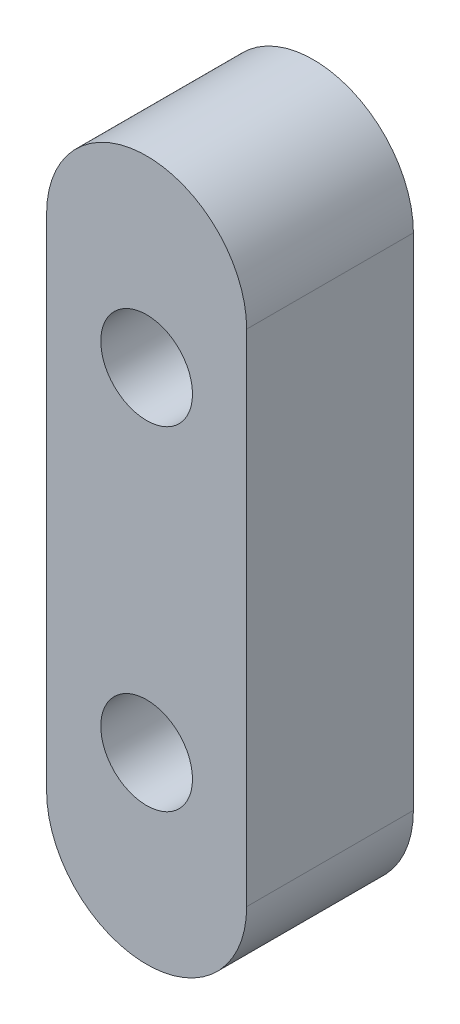
ISO-10303-21;
HEADER;
FILE_DESCRIPTION(('STEP AP214'),'2;1');
FILE_NAME('part.step','',(''),(''),'','','');
FILE_SCHEMA(('AUTOMOTIVE_DESIGN { 1 0 10303 214 1 1 1 1 }'));
ENDSEC;
DATA;
#1=APPLICATION_CONTEXT('core data for automotive mechanical design processes');
#2=APPLICATION_PROTOCOL_DEFINITION('international standard','automotive_design',2000,#1);
#3=PRODUCT_CONTEXT('',#1,'mechanical');
#4=PRODUCT('Part','Part','',(#3));
#5=PRODUCT_RELATED_PRODUCT_CATEGORY('part','',(#4));
#6=PRODUCT_DEFINITION_FORMATION('','',#4);
#7=PRODUCT_DEFINITION_CONTEXT('part definition',#1,'design');
#8=PRODUCT_DEFINITION('design','',#6,#7);
#9=PRODUCT_DEFINITION_SHAPE('','',#8);
#10=(LENGTH_UNIT() NAMED_UNIT(*) SI_UNIT(.MILLI.,.METRE.));
#11=(NAMED_UNIT(*) PLANE_ANGLE_UNIT() SI_UNIT($,.RADIAN.));
#12=(NAMED_UNIT(*) SI_UNIT($,.STERADIAN.) SOLID_ANGLE_UNIT());
#13=UNCERTAINTY_MEASURE_WITH_UNIT(LENGTH_MEASURE(1.E-05),#10,'distance_accuracy_value','');
#14=(GEOMETRIC_REPRESENTATION_CONTEXT(3) GLOBAL_UNCERTAINTY_ASSIGNED_CONTEXT((#13)) GLOBAL_UNIT_ASSIGNED_CONTEXT((#10,
#11,#12)) REPRESENTATION_CONTEXT('',''));
#15=CARTESIAN_POINT('',(0.,0.,0.));
#16=DIRECTION('',(0.,0.,1.));
#17=DIRECTION('',(1.,0.,0.));
#18=AXIS2_PLACEMENT_3D('',#15,#16,#17);
#19=CARTESIAN_POINT('',(0.,-15.,10.));
#20=DIRECTION('',(0.,0.,1.));
#21=DIRECTION('',(1.,0.,0.));
#22=AXIS2_PLACEMENT_3D('',#19,#20,#21);
#23=PLANE('',#22);
#24=CARTESIAN_POINT('',(0.,-10.,10.));
#25=DIRECTION('',(0.,0.,1.));
#26=DIRECTION('',(1.,0.,0.));
#27=AXIS2_PLACEMENT_3D('',#24,#25,#26);
#28=CIRCLE('',#27,2.75);
#29=CARTESIAN_POINT('',(2.75,-10.,10.));
#30=VERTEX_POINT('',#29);
#31=EDGE_CURVE('E99',#30,#30,#28,.T.);
#32=ORIENTED_EDGE('',*,*,#31,.F.);
#33=EDGE_LOOP('',(#32));
#34=FACE_BOUND('',#33,.T.);
#35=CARTESIAN_POINT('',(0.,-15.,10.));
#36=DIRECTION('',(0.,0.,1.));
#37=DIRECTION('',(1.,0.,0.));
#38=AXIS2_PLACEMENT_3D('',#35,#36,#37);
#39=CIRCLE('',#38,6.);
#40=CARTESIAN_POINT('',(-6.,-15.,10.));
#41=VERTEX_POINT('',#40);
#42=CARTESIAN_POINT('',(6.,-15.,10.));
#43=VERTEX_POINT('',#42);
#44=EDGE_CURVE('E84',#41,#43,#39,.T.);
#45=ORIENTED_EDGE('',*,*,#44,.T.);
#46=DIRECTION('',(0.,1.,0.));
#47=VECTOR('',#46,1.);
#48=CARTESIAN_POINT('',(5.99999999999999,15.,10.));
#49=LINE('',#48,#47);
#50=CARTESIAN_POINT('',(5.99999999999999,15.,10.));
#51=VERTEX_POINT('',#50);
#52=EDGE_CURVE('E79',#43,#51,#49,.T.);
#53=ORIENTED_EDGE('',*,*,#52,.T.);
#54=CARTESIAN_POINT('',(0.,15.,10.));
#55=DIRECTION('',(0.,0.,1.));
#56=DIRECTION('',(1.,0.,0.));
#57=AXIS2_PLACEMENT_3D('',#54,#55,#56);
#58=CIRCLE('',#57,5.99999999999999);
#59=CARTESIAN_POINT('',(-5.99999999999999,15.,10.));
#60=VERTEX_POINT('',#59);
#61=EDGE_CURVE('E82',#51,#60,#58,.T.);
#62=ORIENTED_EDGE('',*,*,#61,.T.);
#63=DIRECTION('',(0.,-1.,0.));
#64=VECTOR('',#63,1.);
#65=CARTESIAN_POINT('',(-6.,-15.,10.));
#66=LINE('',#65,#64);
#67=EDGE_CURVE('E49',#60,#41,#66,.T.);
#68=ORIENTED_EDGE('',*,*,#67,.T.);
#69=EDGE_LOOP('',(#45,#53,#62,#68));
#70=FACE_BOUND('',#69,.T.);
#71=CARTESIAN_POINT('',(0.,10.,10.));
#72=DIRECTION('',(0.,0.,1.));
#73=DIRECTION('',(1.,0.,0.));
#74=AXIS2_PLACEMENT_3D('',#71,#72,#73);
#75=CIRCLE('',#74,2.75);
#76=CARTESIAN_POINT('',(2.75,10.,10.));
#77=VERTEX_POINT('',#76);
#78=EDGE_CURVE('E114',#77,#77,#75,.T.);
#79=ORIENTED_EDGE('',*,*,#78,.F.);
#80=EDGE_LOOP('',(#79));
#81=FACE_BOUND('',#80,.T.);
#82=ADVANCED_FACE('F32',(#34,#70,#81),#23,.T.);
#83=CARTESIAN_POINT('',(0.,-15.,0.));
#84=DIRECTION('',(0.,0.,1.));
#85=DIRECTION('',(1.,0.,0.));
#86=AXIS2_PLACEMENT_3D('',#83,#84,#85);
#87=PLANE('',#86);
#88=CARTESIAN_POINT('',(0.,-15.,0.));
#89=DIRECTION('',(0.,0.,1.));
#90=DIRECTION('',(1.,0.,0.));
#91=AXIS2_PLACEMENT_3D('',#88,#89,#90);
#92=CIRCLE('',#91,6.);
#93=CARTESIAN_POINT('',(-6.,-15.,0.));
#94=VERTEX_POINT('',#93);
#95=CARTESIAN_POINT('',(6.,-15.,0.));
#96=VERTEX_POINT('',#95);
#97=EDGE_CURVE('E96',#94,#96,#92,.T.);
#98=ORIENTED_EDGE('',*,*,#97,.F.);
#99=DIRECTION('',(0.,-1.,0.));
#100=VECTOR('',#99,1.);
#101=CARTESIAN_POINT('',(-6.,-15.,0.));
#102=LINE('',#101,#100);
#103=CARTESIAN_POINT('',(-5.99999999999999,15.,0.));
#104=VERTEX_POINT('',#103);
#105=EDGE_CURVE('E72',#104,#94,#102,.T.);
#106=ORIENTED_EDGE('',*,*,#105,.F.);
#107=CARTESIAN_POINT('',(0.,15.,0.));
#108=DIRECTION('',(0.,0.,1.));
#109=DIRECTION('',(1.,0.,0.));
#110=AXIS2_PLACEMENT_3D('',#107,#108,#109);
#111=CIRCLE('',#110,5.99999999999999);
#112=CARTESIAN_POINT('',(5.99999999999999,15.,0.));
#113=VERTEX_POINT('',#112);
#114=EDGE_CURVE('E66',#113,#104,#111,.T.);
#115=ORIENTED_EDGE('',*,*,#114,.F.);
#116=DIRECTION('',(0.,1.,0.));
#117=VECTOR('',#116,1.);
#118=CARTESIAN_POINT('',(5.99999999999999,15.,0.));
#119=LINE('',#118,#117);
#120=EDGE_CURVE('E88',#96,#113,#119,.T.);
#121=ORIENTED_EDGE('',*,*,#120,.F.);
#122=EDGE_LOOP('',(#98,#106,#115,#121));
#123=FACE_BOUND('',#122,.T.);
#124=CARTESIAN_POINT('',(0.,-10.,0.));
#125=DIRECTION('',(0.,0.,1.));
#126=DIRECTION('',(1.,0.,0.));
#127=AXIS2_PLACEMENT_3D('',#124,#125,#126);
#128=CIRCLE('',#127,2.75);
#129=CARTESIAN_POINT('',(2.75,-10.,0.));
#130=VERTEX_POINT('',#129);
#131=EDGE_CURVE('E111',#130,#130,#128,.T.);
#132=ORIENTED_EDGE('',*,*,#131,.T.);
#133=EDGE_LOOP('',(#132));
#134=FACE_BOUND('',#133,.T.);
#135=CARTESIAN_POINT('',(0.,10.,0.));
#136=DIRECTION('',(0.,0.,1.));
#137=DIRECTION('',(1.,0.,0.));
#138=AXIS2_PLACEMENT_3D('',#135,#136,#137);
#139=CIRCLE('',#138,2.75);
#140=CARTESIAN_POINT('',(2.75,10.,0.));
#141=VERTEX_POINT('',#140);
#142=EDGE_CURVE('E117',#141,#141,#139,.T.);
#143=ORIENTED_EDGE('',*,*,#142,.T.);
#144=EDGE_LOOP('',(#143));
#145=FACE_BOUND('',#144,.T.);
#146=ADVANCED_FACE('F107',(#123,#134,#145),#87,.F.);
#147=CARTESIAN_POINT('',(0.,-15.,10.));
#148=DIRECTION('',(0.,0.,-1.));
#149=DIRECTION('',(-1.,0.,0.));
#150=AXIS2_PLACEMENT_3D('',#147,#148,#149);
#151=CYLINDRICAL_SURFACE('',#150,6.);
#152=ORIENTED_EDGE('',*,*,#97,.T.);
#153=DIRECTION('',(0.,0.,-1.));
#154=VECTOR('',#153,1.);
#155=CARTESIAN_POINT('',(6.,-15.,10.));
#156=LINE('',#155,#154);
#157=EDGE_CURVE('E11',#43,#96,#156,.T.);
#158=ORIENTED_EDGE('',*,*,#157,.F.);
#159=ORIENTED_EDGE('',*,*,#44,.F.);
#160=DIRECTION('',(0.,0.,-1.));
#161=VECTOR('',#160,1.);
#162=CARTESIAN_POINT('',(-6.,-15.,10.));
#163=LINE('',#162,#161);
#164=EDGE_CURVE('E92',#41,#94,#163,.T.);
#165=ORIENTED_EDGE('',*,*,#164,.T.);
#166=EDGE_LOOP('',(#152,#158,#159,#165));
#167=FACE_BOUND('',#166,.T.);
#168=ADVANCED_FACE('F34',(#167),#151,.T.);
#169=CARTESIAN_POINT('',(5.99999999999999,15.,10.));
#170=DIRECTION('',(-1.,0.,0.));
#171=DIRECTION('',(0.,-1.,0.));
#172=AXIS2_PLACEMENT_3D('',#169,#170,#171);
#173=PLANE('',#172);
#174=ORIENTED_EDGE('',*,*,#120,.T.);
#175=DIRECTION('',(0.,0.,-1.));
#176=VECTOR('',#175,1.);
#177=CARTESIAN_POINT('',(5.99999999999999,15.,10.));
#178=LINE('',#177,#176);
#179=EDGE_CURVE('E41',#51,#113,#178,.T.);
#180=ORIENTED_EDGE('',*,*,#179,.F.);
#181=ORIENTED_EDGE('',*,*,#52,.F.);
#182=ORIENTED_EDGE('',*,*,#157,.T.);
#183=EDGE_LOOP('',(#174,#180,#181,#182));
#184=FACE_BOUND('',#183,.T.);
#185=ADVANCED_FACE('F87',(#184),#173,.F.);
#186=CARTESIAN_POINT('',(0.,15.,10.));
#187=DIRECTION('',(0.,0.,-1.));
#188=DIRECTION('',(-1.,0.,0.));
#189=AXIS2_PLACEMENT_3D('',#186,#187,#188);
#190=CYLINDRICAL_SURFACE('',#189,5.99999999999999);
#191=ORIENTED_EDGE('',*,*,#114,.T.);
#192=DIRECTION('',(0.,0.,-1.));
#193=VECTOR('',#192,1.);
#194=CARTESIAN_POINT('',(-5.99999999999999,15.,10.));
#195=LINE('',#194,#193);
#196=EDGE_CURVE('E89',#60,#104,#195,.T.);
#197=ORIENTED_EDGE('',*,*,#196,.F.);
#198=ORIENTED_EDGE('',*,*,#61,.F.);
#199=ORIENTED_EDGE('',*,*,#179,.T.);
#200=EDGE_LOOP('',(#191,#197,#198,#199));
#201=FACE_BOUND('',#200,.T.);
#202=ADVANCED_FACE('F90',(#201),#190,.T.);
#203=CARTESIAN_POINT('',(-6.,-15.,10.));
#204=DIRECTION('',(1.,0.,0.));
#205=DIRECTION('',(0.,1.,0.));
#206=AXIS2_PLACEMENT_3D('',#203,#204,#205);
#207=PLANE('',#206);
#208=ORIENTED_EDGE('',*,*,#105,.T.);
#209=ORIENTED_EDGE('',*,*,#164,.F.);
#210=ORIENTED_EDGE('',*,*,#67,.F.);
#211=ORIENTED_EDGE('',*,*,#196,.T.);
#212=EDGE_LOOP('',(#208,#209,#210,#211));
#213=FACE_BOUND('',#212,.T.);
#214=ADVANCED_FACE('F104',(#213),#207,.F.);
#215=CARTESIAN_POINT('',(0.,-10.,10.));
#216=DIRECTION('',(0.,0.,-1.));
#217=DIRECTION('',(-1.,0.,0.));
#218=AXIS2_PLACEMENT_3D('',#215,#216,#217);
#219=CYLINDRICAL_SURFACE('',#218,2.75);
#220=ORIENTED_EDGE('',*,*,#31,.T.);
#221=EDGE_LOOP('',(#220));
#222=FACE_BOUND('',#221,.T.);
#223=ORIENTED_EDGE('',*,*,#131,.F.);
#224=EDGE_LOOP('',(#223));
#225=FACE_BOUND('',#224,.T.);
#226=ADVANCED_FACE('F134',(#222,#225),#219,.F.);
#227=CARTESIAN_POINT('',(0.,10.,10.));
#228=DIRECTION('',(0.,0.,-1.));
#229=DIRECTION('',(-1.,0.,0.));
#230=AXIS2_PLACEMENT_3D('',#227,#228,#229);
#231=CYLINDRICAL_SURFACE('',#230,2.75);
#232=ORIENTED_EDGE('',*,*,#78,.T.);
#233=EDGE_LOOP('',(#232));
#234=FACE_BOUND('',#233,.T.);
#235=ORIENTED_EDGE('',*,*,#142,.F.);
#236=EDGE_LOOP('',(#235));
#237=FACE_BOUND('',#236,.T.);
#238=ADVANCED_FACE('F123',(#234,#237),#231,.F.);
#239=CLOSED_SHELL('',(#82,#146,#168,#185,#202,#214,#226,#238));
#240=MANIFOLD_SOLID_BREP('B2',#239);
#241=ADVANCED_BREP_SHAPE_REPRESENTATION('',(#18,#240),#14);
#242=SHAPE_DEFINITION_REPRESENTATION(#9,#241);
ENDSEC;
END-ISO-10303-21;
